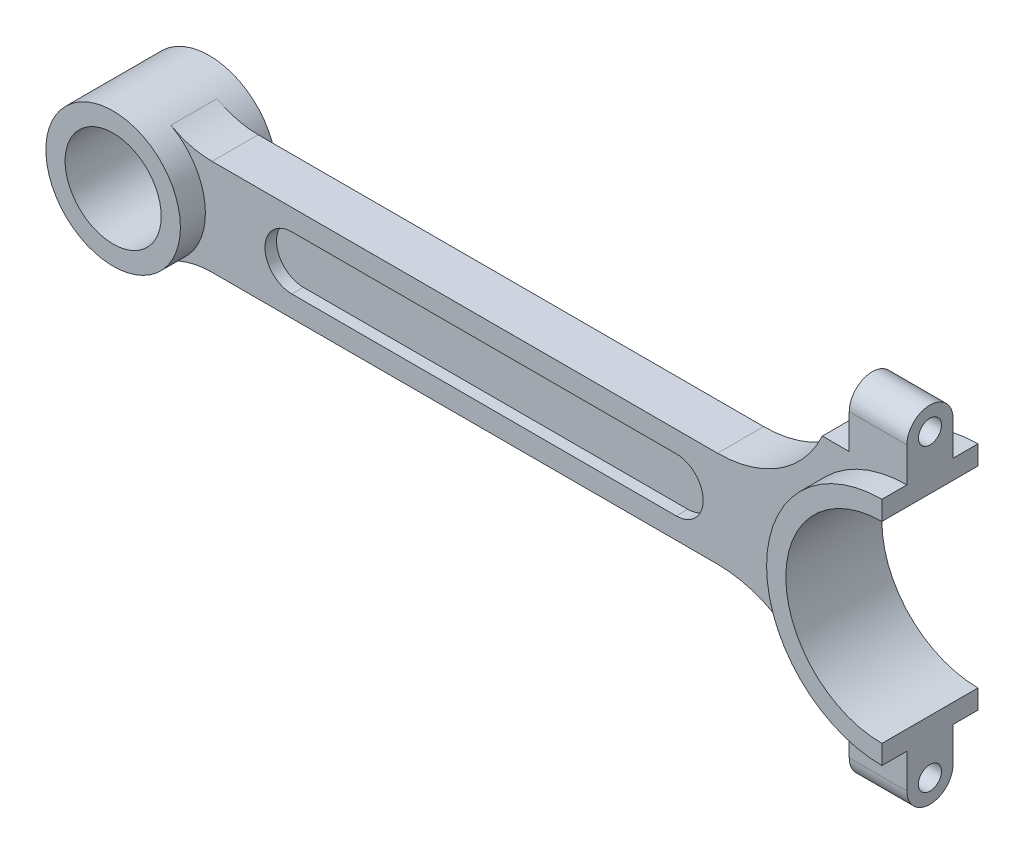
ISO-10303-21;
HEADER;
FILE_DESCRIPTION(('STEP AP214'),'2;1');
FILE_NAME('part.step','',(''),(''),'','','');
FILE_SCHEMA(('AUTOMOTIVE_DESIGN { 1 0 10303 214 1 1 1 1 }'));
ENDSEC;
DATA;
#1=APPLICATION_CONTEXT('core data for automotive mechanical design processes');
#2=APPLICATION_PROTOCOL_DEFINITION('international standard','automotive_design',2000,#1);
#3=PRODUCT_CONTEXT('',#1,'mechanical');
#4=PRODUCT('Part','Part','',(#3));
#5=PRODUCT_RELATED_PRODUCT_CATEGORY('part','',(#4));
#6=PRODUCT_DEFINITION_FORMATION('','',#4);
#7=PRODUCT_DEFINITION_CONTEXT('part definition',#1,'design');
#8=PRODUCT_DEFINITION('design','',#6,#7);
#9=PRODUCT_DEFINITION_SHAPE('','',#8);
#10=(LENGTH_UNIT() NAMED_UNIT(*) SI_UNIT(.MILLI.,.METRE.));
#11=(NAMED_UNIT(*) PLANE_ANGLE_UNIT() SI_UNIT($,.RADIAN.));
#12=(NAMED_UNIT(*) SI_UNIT($,.STERADIAN.) SOLID_ANGLE_UNIT());
#13=UNCERTAINTY_MEASURE_WITH_UNIT(LENGTH_MEASURE(1.E-05),#10,'distance_accuracy_value','');
#14=(GEOMETRIC_REPRESENTATION_CONTEXT(3) GLOBAL_UNCERTAINTY_ASSIGNED_CONTEXT((#13)) GLOBAL_UNIT_ASSIGNED_CONTEXT((#10,
#11,#12)) REPRESENTATION_CONTEXT('',''));
#15=CARTESIAN_POINT('',(0.,0.,0.));
#16=DIRECTION('',(0.,0.,1.));
#17=DIRECTION('',(1.,0.,0.));
#18=AXIS2_PLACEMENT_3D('',#15,#16,#17);
#19=CARTESIAN_POINT('',(400.,0.,-12.));
#20=DIRECTION('',(0.,0.,1.));
#21=DIRECTION('',(1.,0.,0.));
#22=AXIS2_PLACEMENT_3D('',#19,#20,#21);
#23=PLANE('',#22);
#24=CARTESIAN_POINT('',(400.,0.,-12.));
#25=DIRECTION('',(0.,0.,-1.));
#26=DIRECTION('',(1.,0.,0.));
#27=AXIS2_PLACEMENT_3D('',#24,#25,#26);
#28=CIRCLE('',#27,60.);
#29=CARTESIAN_POINT('',(400.,-60.,-12.));
#30=VERTEX_POINT('',#29);
#31=CARTESIAN_POINT('',(400.,60.,-12.));
#32=VERTEX_POINT('',#31);
#33=EDGE_CURVE('E435',#30,#32,#28,.T.);
#34=ORIENTED_EDGE('',*,*,#33,.F.);
#35=DIRECTION('',(0.,-1.,0.));
#36=VECTOR('',#35,1.);
#37=CARTESIAN_POINT('',(400.,-60.,-12.));
#38=LINE('',#37,#36);
#39=CARTESIAN_POINT('',(400.,-78.,-12.));
#40=VERTEX_POINT('',#39);
#41=EDGE_CURVE('E347',#30,#40,#38,.T.);
#42=ORIENTED_EDGE('',*,*,#41,.T.);
#43=DIRECTION('',(1.,0.,0.));
#44=VECTOR('',#43,1.);
#45=CARTESIAN_POINT('',(370.,-78.,-12.));
#46=LINE('',#45,#44);
#47=CARTESIAN_POINT('',(370.,-78.,-12.));
#48=VERTEX_POINT('',#47);
#49=EDGE_CURVE('E343',#48,#40,#46,.T.);
#50=ORIENTED_EDGE('',*,*,#49,.F.);
#51=DIRECTION('',(0.,-1.,0.));
#52=VECTOR('',#51,1.);
#53=CARTESIAN_POINT('',(370.,-60.,-12.));
#54=LINE('',#53,#52);
#55=CARTESIAN_POINT('',(370.,-60.,-12.));
#56=VERTEX_POINT('',#55);
#57=EDGE_CURVE('E333',#56,#48,#54,.T.);
#58=ORIENTED_EDGE('',*,*,#57,.F.);
#59=DIRECTION('',(1.,0.,0.));
#60=VECTOR('',#59,1.);
#61=CARTESIAN_POINT('',(400.,-60.,-12.));
#62=LINE('',#61,#60);
#63=CARTESIAN_POINT('',(356.,-60.,-12.));
#64=VERTEX_POINT('',#63);
#65=EDGE_CURVE('E451',#64,#56,#62,.T.);
#66=ORIENTED_EDGE('',*,*,#65,.F.);
#67=CARTESIAN_POINT('',(301.456439426821,-85.,-12.));
#68=DIRECTION('',(0.,0.,1.));
#69=DIRECTION('',(1.,0.,0.));
#70=AXIS2_PLACEMENT_3D('',#67,#68,#69);
#71=CIRCLE('',#70,60.);
#72=CARTESIAN_POINT('',(301.456439426821,-25.,-12.));
#73=VERTEX_POINT('',#72);
#74=EDGE_CURVE('E549',#64,#73,#71,.T.);
#75=ORIENTED_EDGE('',*,*,#74,.T.);
#76=DIRECTION('',(1.,0.,0.));
#77=VECTOR('',#76,1.);
#78=CARTESIAN_POINT('',(35.,-25.,-12.));
#79=LINE('',#78,#77);
#80=CARTESIAN_POINT('',(38.4707681233427,-25.,-12.));
#81=VERTEX_POINT('',#80);
#82=EDGE_CURVE('E481',#81,#73,#79,.T.);
#83=ORIENTED_EDGE('',*,*,#82,.F.);
#84=CARTESIAN_POINT('',(38.4707681233427,-69.,-12.));
#85=DIRECTION('',(0.,0.,1.));
#86=DIRECTION('',(1.,0.,0.));
#87=AXIS2_PLACEMENT_3D('',#84,#85,#86);
#88=CIRCLE('',#87,44.);
#89=CARTESIAN_POINT('',(17.044011193886,-30.5696202531646,-12.));
#90=VERTEX_POINT('',#89);
#91=EDGE_CURVE('E527',#81,#90,#88,.T.);
#92=ORIENTED_EDGE('',*,*,#91,.T.);
#93=CARTESIAN_POINT('',(0.,0.,-12.));
#94=DIRECTION('',(0.,0.,-1.));
#95=DIRECTION('',(1.,0.,0.));
#96=AXIS2_PLACEMENT_3D('',#93,#94,#95);
#97=CIRCLE('',#96,35.);
#98=CARTESIAN_POINT('',(17.044011193886,30.5696202531646,-12.));
#99=VERTEX_POINT('',#98);
#100=EDGE_CURVE('E478',#99,#90,#97,.T.);
#101=ORIENTED_EDGE('',*,*,#100,.F.);
#102=CARTESIAN_POINT('',(38.4707681233427,69.,-12.));
#103=DIRECTION('',(0.,0.,1.));
#104=DIRECTION('',(1.,0.,0.));
#105=AXIS2_PLACEMENT_3D('',#102,#103,#104);
#106=CIRCLE('',#105,44.);
#107=CARTESIAN_POINT('',(38.4707681233427,25.,-12.));
#108=VERTEX_POINT('',#107);
#109=EDGE_CURVE('E534',#99,#108,#106,.T.);
#110=ORIENTED_EDGE('',*,*,#109,.T.);
#111=DIRECTION('',(-1.,0.,0.));
#112=VECTOR('',#111,1.);
#113=CARTESIAN_POINT('',(35.,25.,-12.));
#114=LINE('',#113,#112);
#115=CARTESIAN_POINT('',(301.456439426821,25.,-12.));
#116=VERTEX_POINT('',#115);
#117=EDGE_CURVE('E475',#116,#108,#114,.T.);
#118=ORIENTED_EDGE('',*,*,#117,.F.);
#119=CARTESIAN_POINT('',(301.456439426821,85.,-12.));
#120=DIRECTION('',(0.,0.,1.));
#121=DIRECTION('',(1.,0.,0.));
#122=AXIS2_PLACEMENT_3D('',#119,#120,#121);
#123=CIRCLE('',#122,60.);
#124=CARTESIAN_POINT('',(356.,60.,-12.));
#125=VERTEX_POINT('',#124);
#126=EDGE_CURVE('E52',#116,#125,#123,.T.);
#127=ORIENTED_EDGE('',*,*,#126,.T.);
#128=DIRECTION('',(-1.,0.,0.));
#129=VECTOR('',#128,1.);
#130=CARTESIAN_POINT('',(400.,60.,-12.));
#131=LINE('',#130,#129);
#132=CARTESIAN_POINT('',(370.,60.,-12.));
#133=VERTEX_POINT('',#132);
#134=EDGE_CURVE('E472',#133,#125,#131,.T.);
#135=ORIENTED_EDGE('',*,*,#134,.F.);
#136=DIRECTION('',(0.,1.,0.));
#137=VECTOR('',#136,1.);
#138=CARTESIAN_POINT('',(370.,60.,-12.));
#139=LINE('',#138,#137);
#140=CARTESIAN_POINT('',(370.,78.,-12.));
#141=VERTEX_POINT('',#140);
#142=EDGE_CURVE('E380',#133,#141,#139,.T.);
#143=ORIENTED_EDGE('',*,*,#142,.T.);
#144=DIRECTION('',(1.,0.,0.));
#145=VECTOR('',#144,1.);
#146=CARTESIAN_POINT('',(370.,78.,-12.));
#147=LINE('',#146,#145);
#148=CARTESIAN_POINT('',(400.,78.,-12.));
#149=VERTEX_POINT('',#148);
#150=EDGE_CURVE('E395',#141,#149,#147,.T.);
#151=ORIENTED_EDGE('',*,*,#150,.T.);
#152=DIRECTION('',(0.,1.,0.));
#153=VECTOR('',#152,1.);
#154=CARTESIAN_POINT('',(400.,60.,-12.));
#155=LINE('',#154,#153);
#156=EDGE_CURVE('E373',#32,#149,#155,.T.);
#157=ORIENTED_EDGE('',*,*,#156,.F.);
#158=EDGE_LOOP('',(#34,#42,#50,#58,#66,#75,#83,#92,#101,#110,#118,#127,#135,#143,#151,#157));
#159=FACE_BOUND('',#158,.T.);
#160=CARTESIAN_POINT('',(280.,0.,-12.));
#161=DIRECTION('',(0.,0.,1.));
#162=DIRECTION('',(1.,0.,0.));
#163=AXIS2_PLACEMENT_3D('',#160,#161,#162);
#164=CIRCLE('',#163,14.);
#165=CARTESIAN_POINT('',(280.,-14.,-12.));
#166=VERTEX_POINT('',#165);
#167=CARTESIAN_POINT('',(280.,14.,-12.));
#168=VERTEX_POINT('',#167);
#169=EDGE_CURVE('E59',#166,#168,#164,.T.);
#170=ORIENTED_EDGE('',*,*,#169,.T.);
#171=DIRECTION('',(-1.,0.,0.));
#172=VECTOR('',#171,1.);
#173=CARTESIAN_POINT('',(280.,14.,-12.));
#174=LINE('',#173,#172);
#175=CARTESIAN_POINT('',(80.,14.,-12.));
#176=VERTEX_POINT('',#175);
#177=EDGE_CURVE('E251',#168,#176,#174,.T.);
#178=ORIENTED_EDGE('',*,*,#177,.T.);
#179=CARTESIAN_POINT('',(80.,0.,-12.));
#180=DIRECTION('',(0.,0.,1.));
#181=DIRECTION('',(1.,0.,0.));
#182=AXIS2_PLACEMENT_3D('',#179,#180,#181);
#183=CIRCLE('',#182,14.);
#184=CARTESIAN_POINT('',(80.,-14.,-12.));
#185=VERTEX_POINT('',#184);
#186=EDGE_CURVE('E255',#176,#185,#183,.T.);
#187=ORIENTED_EDGE('',*,*,#186,.T.);
#188=DIRECTION('',(1.,0.,0.));
#189=VECTOR('',#188,1.);
#190=CARTESIAN_POINT('',(280.,-14.,-12.));
#191=LINE('',#190,#189);
#192=EDGE_CURVE('E264',#185,#166,#191,.T.);
#193=ORIENTED_EDGE('',*,*,#192,.T.);
#194=EDGE_LOOP('',(#170,#178,#187,#193));
#195=FACE_BOUND('',#194,.T.);
#196=ADVANCED_FACE('F43',(#159,#195),#23,.F.);
#197=CARTESIAN_POINT('',(400.,-60.,12.));
#198=DIRECTION('',(0.,1.,0.));
#199=DIRECTION('',(-1.,0.,0.));
#200=AXIS2_PLACEMENT_3D('',#197,#198,#199);
#201=PLANE('',#200);
#202=DIRECTION('',(0.,0.,-1.));
#203=VECTOR('',#202,1.);
#204=CARTESIAN_POINT('',(370.,-60.,12.));
#205=LINE('',#204,#203);
#206=CARTESIAN_POINT('',(370.,-60.,12.));
#207=VERTEX_POINT('',#206);
#208=EDGE_CURVE('E337',#207,#56,#205,.T.);
#209=ORIENTED_EDGE('',*,*,#208,.F.);
#210=DIRECTION('',(1.,0.,0.));
#211=VECTOR('',#210,1.);
#212=CARTESIAN_POINT('',(400.,-60.,12.));
#213=LINE('',#212,#211);
#214=CARTESIAN_POINT('',(356.,-60.,12.));
#215=VERTEX_POINT('',#214);
#216=EDGE_CURVE('E464',#215,#207,#213,.T.);
#217=ORIENTED_EDGE('',*,*,#216,.F.);
#218=DIRECTION('',(0.,0.,-1.));
#219=VECTOR('',#218,1.);
#220=CARTESIAN_POINT('',(356.,-60.,12.));
#221=LINE('',#220,#219);
#222=EDGE_CURVE('E468',#215,#64,#221,.T.);
#223=ORIENTED_EDGE('',*,*,#222,.T.);
#224=ORIENTED_EDGE('',*,*,#65,.T.);
#225=EDGE_LOOP('',(#209,#217,#223,#224));
#226=FACE_BOUND('',#225,.T.);
#227=ADVANCED_FACE('F607',(#226),#201,.F.);
#228=CARTESIAN_POINT('',(400.,60.,12.));
#229=DIRECTION('',(0.,-1.,0.));
#230=DIRECTION('',(1.,0.,0.));
#231=AXIS2_PLACEMENT_3D('',#228,#229,#230);
#232=PLANE('',#231);
#233=DIRECTION('',(0.,0.,-1.));
#234=VECTOR('',#233,1.);
#235=CARTESIAN_POINT('',(370.,60.,12.));
#236=LINE('',#235,#234);
#237=CARTESIAN_POINT('',(370.,60.,12.));
#238=VERTEX_POINT('',#237);
#239=EDGE_CURVE('E377',#238,#133,#236,.T.);
#240=ORIENTED_EDGE('',*,*,#239,.T.);
#241=ORIENTED_EDGE('',*,*,#134,.T.);
#242=DIRECTION('',(0.,0.,-1.));
#243=VECTOR('',#242,1.);
#244=CARTESIAN_POINT('',(356.,60.,12.));
#245=LINE('',#244,#243);
#246=CARTESIAN_POINT('',(356.,60.,12.));
#247=VERTEX_POINT('',#246);
#248=EDGE_CURVE('E491',#247,#125,#245,.T.);
#249=ORIENTED_EDGE('',*,*,#248,.F.);
#250=DIRECTION('',(-1.,0.,0.));
#251=VECTOR('',#250,1.);
#252=CARTESIAN_POINT('',(400.,60.,12.));
#253=LINE('',#252,#251);
#254=EDGE_CURVE('E450',#238,#247,#253,.T.);
#255=ORIENTED_EDGE('',*,*,#254,.F.);
#256=EDGE_LOOP('',(#240,#241,#249,#255));
#257=FACE_BOUND('',#256,.T.);
#258=ADVANCED_FACE('F567',(#257),#232,.F.);
#259=CARTESIAN_POINT('',(0.,0.,25.));
#260=DIRECTION('',(0.,0.,1.));
#261=DIRECTION('',(1.,0.,0.));
#262=AXIS2_PLACEMENT_3D('',#259,#260,#261);
#263=PLANE('',#262);
#264=CARTESIAN_POINT('',(0.,0.,25.));
#265=DIRECTION('',(0.,0.,1.));
#266=DIRECTION('',(1.,0.,0.));
#267=AXIS2_PLACEMENT_3D('',#264,#265,#266);
#268=CIRCLE('',#267,35.);
#269=CARTESIAN_POINT('',(35.,0.,25.));
#270=VERTEX_POINT('',#269);
#271=EDGE_CURVE('E504',#270,#270,#268,.T.);
#272=ORIENTED_EDGE('',*,*,#271,.T.);
#273=EDGE_LOOP('',(#272));
#274=FACE_BOUND('',#273,.T.);
#275=CARTESIAN_POINT('',(0.,0.,25.));
#276=DIRECTION('',(0.,0.,1.));
#277=DIRECTION('',(1.,0.,0.));
#278=AXIS2_PLACEMENT_3D('',#275,#276,#277);
#279=CIRCLE('',#278,25.);
#280=CARTESIAN_POINT('',(25.,0.,25.));
#281=VERTEX_POINT('',#280);
#282=EDGE_CURVE('E496',#281,#281,#279,.T.);
#283=ORIENTED_EDGE('',*,*,#282,.F.);
#284=EDGE_LOOP('',(#283));
#285=FACE_BOUND('',#284,.T.);
#286=ADVANCED_FACE('F896',(#274,#285),#263,.T.);
#287=CARTESIAN_POINT('',(0.,0.,-25.));
#288=DIRECTION('',(0.,0.,1.));
#289=DIRECTION('',(1.,0.,0.));
#290=AXIS2_PLACEMENT_3D('',#287,#288,#289);
#291=PLANE('',#290);
#292=CARTESIAN_POINT('',(0.,0.,-25.));
#293=DIRECTION('',(0.,0.,1.));
#294=DIRECTION('',(1.,0.,0.));
#295=AXIS2_PLACEMENT_3D('',#292,#293,#294);
#296=CIRCLE('',#295,35.);
#297=CARTESIAN_POINT('',(35.,0.,-25.));
#298=VERTEX_POINT('',#297);
#299=EDGE_CURVE('E500',#298,#298,#296,.T.);
#300=ORIENTED_EDGE('',*,*,#299,.F.);
#301=EDGE_LOOP('',(#300));
#302=FACE_BOUND('',#301,.T.);
#303=CARTESIAN_POINT('',(0.,0.,-25.));
#304=DIRECTION('',(0.,0.,1.));
#305=DIRECTION('',(1.,0.,0.));
#306=AXIS2_PLACEMENT_3D('',#303,#304,#305);
#307=CIRCLE('',#306,25.);
#308=CARTESIAN_POINT('',(25.,0.,-25.));
#309=VERTEX_POINT('',#308);
#310=EDGE_CURVE('E495',#309,#309,#307,.T.);
#311=ORIENTED_EDGE('',*,*,#310,.T.);
#312=EDGE_LOOP('',(#311));
#313=FACE_BOUND('',#312,.T.);
#314=ADVANCED_FACE('F1028',(#302,#313),#291,.F.);
#315=CARTESIAN_POINT('',(0.,0.,25.));
#316=DIRECTION('',(0.,0.,-1.));
#317=DIRECTION('',(-1.,0.,0.));
#318=AXIS2_PLACEMENT_3D('',#315,#316,#317);
#319=CYLINDRICAL_SURFACE('',#318,35.);
#320=ORIENTED_EDGE('',*,*,#100,.T.);
#321=DIRECTION('',(0.,0.,-1.));
#322=VECTOR('',#321,1.);
#323=CARTESIAN_POINT('',(17.044011193886,-30.5696202531646,25.));
#324=LINE('',#323,#322);
#325=CARTESIAN_POINT('',(17.044011193886,-30.5696202531646,12.));
#326=VERTEX_POINT('',#325);
#327=EDGE_CURVE('E519',#90,#326,#324,.F.);
#328=ORIENTED_EDGE('',*,*,#327,.T.);
#329=CARTESIAN_POINT('',(0.,0.,12.));
#330=DIRECTION('',(0.,0.,-1.));
#331=DIRECTION('',(1.,0.,0.));
#332=AXIS2_PLACEMENT_3D('',#329,#330,#331);
#333=CIRCLE('',#332,35.);
#334=CARTESIAN_POINT('',(17.044011193886,30.5696202531646,12.));
#335=VERTEX_POINT('',#334);
#336=EDGE_CURVE('E457',#335,#326,#333,.T.);
#337=ORIENTED_EDGE('',*,*,#336,.F.);
#338=DIRECTION('',(0.,0.,-1.));
#339=VECTOR('',#338,1.);
#340=CARTESIAN_POINT('',(17.044011193886,30.5696202531646,25.));
#341=LINE('',#340,#339);
#342=EDGE_CURVE('E515',#335,#99,#341,.T.);
#343=ORIENTED_EDGE('',*,*,#342,.T.);
#344=EDGE_LOOP('',(#320,#328,#337,#343));
#345=FACE_BOUND('',#344,.T.);
#346=ORIENTED_EDGE('',*,*,#271,.F.);
#347=EDGE_LOOP('',(#346));
#348=FACE_BOUND('',#347,.T.);
#349=ORIENTED_EDGE('',*,*,#299,.T.);
#350=EDGE_LOOP('',(#349));
#351=FACE_BOUND('',#350,.T.);
#352=ADVANCED_FACE('F630',(#345,#348,#351),#319,.T.);
#353=CARTESIAN_POINT('',(0.,0.,25.));
#354=DIRECTION('',(0.,0.,-1.));
#355=DIRECTION('',(-1.,0.,0.));
#356=AXIS2_PLACEMENT_3D('',#353,#354,#355);
#357=CYLINDRICAL_SURFACE('',#356,25.);
#358=ORIENTED_EDGE('',*,*,#282,.T.);
#359=EDGE_LOOP('',(#358));
#360=FACE_BOUND('',#359,.T.);
#361=ORIENTED_EDGE('',*,*,#310,.F.);
#362=EDGE_LOOP('',(#361));
#363=FACE_BOUND('',#362,.T.);
#364=ADVANCED_FACE('F636',(#360,#363),#357,.F.);
#365=CARTESIAN_POINT('',(35.,25.,12.));
#366=DIRECTION('',(0.,-1.,0.));
#367=DIRECTION('',(0.,0.,-1.));
#368=AXIS2_PLACEMENT_3D('',#365,#366,#367);
#369=PLANE('',#368);
#370=DIRECTION('',(-1.,0.,0.));
#371=VECTOR('',#370,1.);
#372=CARTESIAN_POINT('',(35.,25.,12.));
#373=LINE('',#372,#371);
#374=CARTESIAN_POINT('',(301.456439426821,25.,12.));
#375=VERTEX_POINT('',#374);
#376=CARTESIAN_POINT('',(38.4707681233427,25.,12.));
#377=VERTEX_POINT('',#376);
#378=EDGE_CURVE('E454',#375,#377,#373,.T.);
#379=ORIENTED_EDGE('',*,*,#378,.F.);
#380=DIRECTION('',(0.,0.,-1.));
#381=VECTOR('',#380,1.);
#382=CARTESIAN_POINT('',(301.456439426821,25.,12.));
#383=LINE('',#382,#381);
#384=EDGE_CURVE('E545',#375,#116,#383,.T.);
#385=ORIENTED_EDGE('',*,*,#384,.T.);
#386=ORIENTED_EDGE('',*,*,#117,.T.);
#387=DIRECTION('',(0.,0.,1.));
#388=VECTOR('',#387,1.);
#389=CARTESIAN_POINT('',(38.4707681233427,25.,12.));
#390=LINE('',#389,#388);
#391=EDGE_CURVE('E523',#108,#377,#390,.T.);
#392=ORIENTED_EDGE('',*,*,#391,.T.);
#393=EDGE_LOOP('',(#379,#385,#386,#392));
#394=FACE_BOUND('',#393,.T.);
#395=ADVANCED_FACE('F634',(#394),#369,.F.);
#396=CARTESIAN_POINT('',(35.,-25.,12.));
#397=DIRECTION('',(0.,1.,0.));
#398=DIRECTION('',(-1.,0.,0.));
#399=AXIS2_PLACEMENT_3D('',#396,#397,#398);
#400=PLANE('',#399);
#401=ORIENTED_EDGE('',*,*,#82,.T.);
#402=DIRECTION('',(0.,0.,1.));
#403=VECTOR('',#402,1.);
#404=CARTESIAN_POINT('',(301.456439426821,-25.,12.));
#405=LINE('',#404,#403);
#406=CARTESIAN_POINT('',(301.456439426821,-25.,12.));
#407=VERTEX_POINT('',#406);
#408=EDGE_CURVE('E542',#73,#407,#405,.T.);
#409=ORIENTED_EDGE('',*,*,#408,.T.);
#410=DIRECTION('',(1.,0.,0.));
#411=VECTOR('',#410,1.);
#412=CARTESIAN_POINT('',(35.,-25.,12.));
#413=LINE('',#412,#411);
#414=CARTESIAN_POINT('',(38.4707681233427,-25.,12.));
#415=VERTEX_POINT('',#414);
#416=EDGE_CURVE('E460',#415,#407,#413,.T.);
#417=ORIENTED_EDGE('',*,*,#416,.F.);
#418=DIRECTION('',(0.,0.,1.));
#419=VECTOR('',#418,1.);
#420=CARTESIAN_POINT('',(38.4707681233427,-25.,-12.));
#421=LINE('',#420,#419);
#422=EDGE_CURVE('E508',#415,#81,#421,.F.);
#423=ORIENTED_EDGE('',*,*,#422,.T.);
#424=EDGE_LOOP('',(#401,#409,#417,#423));
#425=FACE_BOUND('',#424,.T.);
#426=ADVANCED_FACE('F616',(#425),#400,.F.);
#427=CARTESIAN_POINT('',(400.,0.,12.));
#428=DIRECTION('',(0.,0.,1.));
#429=DIRECTION('',(1.,0.,0.));
#430=AXIS2_PLACEMENT_3D('',#427,#428,#429);
#431=PLANE('',#430);
#432=CARTESIAN_POINT('',(280.,0.,12.));
#433=DIRECTION('',(0.,0.,1.));
#434=DIRECTION('',(1.,0.,0.));
#435=AXIS2_PLACEMENT_3D('',#432,#433,#434);
#436=CIRCLE('',#435,14.);
#437=CARTESIAN_POINT('',(280.,-14.,12.));
#438=VERTEX_POINT('',#437);
#439=CARTESIAN_POINT('',(280.,14.,12.));
#440=VERTEX_POINT('',#439);
#441=EDGE_CURVE('E67',#438,#440,#436,.T.);
#442=ORIENTED_EDGE('',*,*,#441,.F.);
#443=DIRECTION('',(1.,0.,0.));
#444=VECTOR('',#443,1.);
#445=CARTESIAN_POINT('',(280.,-14.,12.));
#446=LINE('',#445,#444);
#447=CARTESIAN_POINT('',(80.,-14.,12.));
#448=VERTEX_POINT('',#447);
#449=EDGE_CURVE('E283',#448,#438,#446,.T.);
#450=ORIENTED_EDGE('',*,*,#449,.F.);
#451=CARTESIAN_POINT('',(80.,0.,12.));
#452=DIRECTION('',(0.,0.,1.));
#453=DIRECTION('',(1.,0.,0.));
#454=AXIS2_PLACEMENT_3D('',#451,#452,#453);
#455=CIRCLE('',#454,14.);
#456=CARTESIAN_POINT('',(80.,14.,12.));
#457=VERTEX_POINT('',#456);
#458=EDGE_CURVE('E302',#457,#448,#455,.T.);
#459=ORIENTED_EDGE('',*,*,#458,.F.);
#460=DIRECTION('',(-1.,0.,0.));
#461=VECTOR('',#460,1.);
#462=CARTESIAN_POINT('',(280.,14.,12.));
#463=LINE('',#462,#461);
#464=EDGE_CURVE('E298',#440,#457,#463,.T.);
#465=ORIENTED_EDGE('',*,*,#464,.F.);
#466=EDGE_LOOP('',(#442,#450,#459,#465));
#467=FACE_BOUND('',#466,.T.);
#468=CARTESIAN_POINT('',(400.,0.,12.));
#469=DIRECTION('',(0.,0.,-1.));
#470=DIRECTION('',(1.,0.,0.));
#471=AXIS2_PLACEMENT_3D('',#468,#469,#470);
#472=CIRCLE('',#471,60.);
#473=CARTESIAN_POINT('',(400.,-60.,12.));
#474=VERTEX_POINT('',#473);
#475=CARTESIAN_POINT('',(400.,60.,12.));
#476=VERTEX_POINT('',#475);
#477=EDGE_CURVE('E447',#474,#476,#472,.T.);
#478=ORIENTED_EDGE('',*,*,#477,.T.);
#479=DIRECTION('',(0.,-1.,0.));
#480=VECTOR('',#479,1.);
#481=CARTESIAN_POINT('',(400.,78.,12.));
#482=LINE('',#481,#480);
#483=CARTESIAN_POINT('',(400.,78.,12.));
#484=VERTEX_POINT('',#483);
#485=EDGE_CURVE('E388',#484,#476,#482,.T.);
#486=ORIENTED_EDGE('',*,*,#485,.F.);
#487=DIRECTION('',(1.,0.,0.));
#488=VECTOR('',#487,1.);
#489=CARTESIAN_POINT('',(370.,78.,12.));
#490=LINE('',#489,#488);
#491=CARTESIAN_POINT('',(370.,78.,12.));
#492=VERTEX_POINT('',#491);
#493=EDGE_CURVE('E384',#492,#484,#490,.T.);
#494=ORIENTED_EDGE('',*,*,#493,.F.);
#495=DIRECTION('',(0.,-1.,0.));
#496=VECTOR('',#495,1.);
#497=CARTESIAN_POINT('',(370.,78.,12.));
#498=LINE('',#497,#496);
#499=EDGE_CURVE('E372',#492,#238,#498,.T.);
#500=ORIENTED_EDGE('',*,*,#499,.T.);
#501=ORIENTED_EDGE('',*,*,#254,.T.);
#502=CARTESIAN_POINT('',(301.456439426821,85.,12.));
#503=DIRECTION('',(0.,0.,1.));
#504=DIRECTION('',(1.,0.,0.));
#505=AXIS2_PLACEMENT_3D('',#502,#503,#504);
#506=CIRCLE('',#505,60.);
#507=EDGE_CURVE('E11',#247,#375,#506,.F.);
#508=ORIENTED_EDGE('',*,*,#507,.T.);
#509=ORIENTED_EDGE('',*,*,#378,.T.);
#510=CARTESIAN_POINT('',(38.4707681233427,69.,12.));
#511=DIRECTION('',(0.,0.,1.));
#512=DIRECTION('',(1.,0.,0.));
#513=AXIS2_PLACEMENT_3D('',#510,#511,#512);
#514=CIRCLE('',#513,44.);
#515=EDGE_CURVE('E538',#377,#335,#514,.F.);
#516=ORIENTED_EDGE('',*,*,#515,.T.);
#517=ORIENTED_EDGE('',*,*,#336,.T.);
#518=CARTESIAN_POINT('',(38.4707681233427,-69.,12.));
#519=DIRECTION('',(0.,0.,1.));
#520=DIRECTION('',(1.,0.,0.));
#521=AXIS2_PLACEMENT_3D('',#518,#519,#520);
#522=CIRCLE('',#521,44.);
#523=EDGE_CURVE('E531',#326,#415,#522,.F.);
#524=ORIENTED_EDGE('',*,*,#523,.T.);
#525=ORIENTED_EDGE('',*,*,#416,.T.);
#526=CARTESIAN_POINT('',(301.456439426821,-85.,12.));
#527=DIRECTION('',(0.,0.,1.));
#528=DIRECTION('',(1.,0.,0.));
#529=AXIS2_PLACEMENT_3D('',#526,#527,#528);
#530=CIRCLE('',#529,60.);
#531=EDGE_CURVE('E552',#407,#215,#530,.F.);
#532=ORIENTED_EDGE('',*,*,#531,.T.);
#533=ORIENTED_EDGE('',*,*,#216,.T.);
#534=DIRECTION('',(0.,1.,0.));
#535=VECTOR('',#534,1.);
#536=CARTESIAN_POINT('',(370.,-78.,12.));
#537=LINE('',#536,#535);
#538=CARTESIAN_POINT('',(370.,-78.,12.));
#539=VERTEX_POINT('',#538);
#540=EDGE_CURVE('E340',#539,#207,#537,.T.);
#541=ORIENTED_EDGE('',*,*,#540,.F.);
#542=DIRECTION('',(1.,0.,0.));
#543=VECTOR('',#542,1.);
#544=CARTESIAN_POINT('',(370.,-78.,12.));
#545=LINE('',#544,#543);
#546=CARTESIAN_POINT('',(400.,-78.,12.));
#547=VERTEX_POINT('',#546);
#548=EDGE_CURVE('E352',#539,#547,#545,.T.);
#549=ORIENTED_EDGE('',*,*,#548,.T.);
#550=DIRECTION('',(0.,1.,0.));
#551=VECTOR('',#550,1.);
#552=CARTESIAN_POINT('',(400.,-78.,12.));
#553=LINE('',#552,#551);
#554=EDGE_CURVE('E334',#547,#474,#553,.T.);
#555=ORIENTED_EDGE('',*,*,#554,.T.);
#556=EDGE_LOOP('',(#478,#486,#494,#500,#501,#508,#509,#516,#517,#524,#525,#532,#533,#541,#549,#555));
#557=FACE_BOUND('',#556,.T.);
#558=ADVANCED_FACE('F574',(#467,#557),#431,.T.);
#559=CARTESIAN_POINT('',(400.,0.,25.));
#560=DIRECTION('',(0.,0.,-1.));
#561=DIRECTION('',(-1.,0.,0.));
#562=AXIS2_PLACEMENT_3D('',#559,#560,#561);
#563=CYLINDRICAL_SURFACE('',#562,60.);
#564=DIRECTION('',(0.,0.,-1.));
#565=VECTOR('',#564,1.);
#566=CARTESIAN_POINT('',(400.,-60.,25.));
#567=LINE('',#566,#565);
#568=CARTESIAN_POINT('',(400.,-60.,-25.));
#569=VERTEX_POINT('',#568);
#570=EDGE_CURVE('E409',#30,#569,#567,.T.);
#571=ORIENTED_EDGE('',*,*,#570,.F.);
#572=ORIENTED_EDGE('',*,*,#33,.T.);
#573=DIRECTION('',(0.,0.,-1.));
#574=VECTOR('',#573,1.);
#575=CARTESIAN_POINT('',(400.,60.,25.));
#576=LINE('',#575,#574);
#577=CARTESIAN_POINT('',(400.,60.,-25.));
#578=VERTEX_POINT('',#577);
#579=EDGE_CURVE('E404',#32,#578,#576,.T.);
#580=ORIENTED_EDGE('',*,*,#579,.T.);
#581=CARTESIAN_POINT('',(400.,0.,-25.));
#582=DIRECTION('',(0.,0.,1.));
#583=DIRECTION('',(1.,0.,0.));
#584=AXIS2_PLACEMENT_3D('',#581,#582,#583);
#585=CIRCLE('',#584,60.);
#586=EDGE_CURVE('E422',#578,#569,#585,.T.);
#587=ORIENTED_EDGE('',*,*,#586,.T.);
#588=EDGE_LOOP('',(#571,#572,#580,#587));
#589=FACE_BOUND('',#588,.T.);
#590=ADVANCED_FACE('F587',(#589),#563,.T.);
#591=CARTESIAN_POINT('',(400.,0.,25.));
#592=DIRECTION('',(0.,0.,-1.));
#593=DIRECTION('',(-1.,0.,0.));
#594=AXIS2_PLACEMENT_3D('',#591,#592,#593);
#595=CYLINDRICAL_SURFACE('',#594,50.);
#596=CARTESIAN_POINT('',(400.,0.,-25.));
#597=DIRECTION('',(0.,0.,-1.));
#598=DIRECTION('',(1.,0.,0.));
#599=AXIS2_PLACEMENT_3D('',#596,#597,#598);
#600=CIRCLE('',#599,50.);
#601=CARTESIAN_POINT('',(400.,-50.,-25.));
#602=VERTEX_POINT('',#601);
#603=CARTESIAN_POINT('',(400.,50.,-25.));
#604=VERTEX_POINT('',#603);
#605=EDGE_CURVE('E431',#602,#604,#600,.T.);
#606=ORIENTED_EDGE('',*,*,#605,.T.);
#607=DIRECTION('',(0.,0.,-1.));
#608=VECTOR('',#607,1.);
#609=CARTESIAN_POINT('',(400.,50.,25.));
#610=LINE('',#609,#608);
#611=CARTESIAN_POINT('',(400.,50.,25.));
#612=VERTEX_POINT('',#611);
#613=EDGE_CURVE('E398',#612,#604,#610,.T.);
#614=ORIENTED_EDGE('',*,*,#613,.F.);
#615=CARTESIAN_POINT('',(400.,0.,25.));
#616=DIRECTION('',(0.,0.,-1.));
#617=DIRECTION('',(1.,0.,0.));
#618=AXIS2_PLACEMENT_3D('',#615,#616,#617);
#619=CIRCLE('',#618,50.);
#620=CARTESIAN_POINT('',(400.,-50.,25.));
#621=VERTEX_POINT('',#620);
#622=EDGE_CURVE('E423',#621,#612,#619,.T.);
#623=ORIENTED_EDGE('',*,*,#622,.F.);
#624=DIRECTION('',(0.,0.,-1.));
#625=VECTOR('',#624,1.);
#626=CARTESIAN_POINT('',(400.,-50.,25.));
#627=LINE('',#626,#625);
#628=EDGE_CURVE('E414',#621,#602,#627,.T.);
#629=ORIENTED_EDGE('',*,*,#628,.T.);
#630=EDGE_LOOP('',(#606,#614,#623,#629));
#631=FACE_BOUND('',#630,.T.);
#632=ADVANCED_FACE('F672',(#631),#595,.F.);
#633=CARTESIAN_POINT('',(400.,50.,25.));
#634=DIRECTION('',(-1.,0.,0.));
#635=DIRECTION('',(0.,0.,1.));
#636=AXIS2_PLACEMENT_3D('',#633,#634,#635);
#637=PLANE('',#636);
#638=DIRECTION('',(0.,1.,0.));
#639=VECTOR('',#638,1.);
#640=CARTESIAN_POINT('',(400.,50.,-25.));
#641=LINE('',#640,#639);
#642=EDGE_CURVE('E427',#604,#578,#641,.T.);
#643=ORIENTED_EDGE('',*,*,#642,.T.);
#644=ORIENTED_EDGE('',*,*,#579,.F.);
#645=ORIENTED_EDGE('',*,*,#156,.T.);
#646=CARTESIAN_POINT('',(400.,78.,0.));
#647=DIRECTION('',(1.,0.,0.));
#648=DIRECTION('',(0.,0.,-1.));
#649=AXIS2_PLACEMENT_3D('',#646,#647,#648);
#650=CIRCLE('',#649,12.);
#651=EDGE_CURVE('E364',#149,#484,#650,.T.);
#652=ORIENTED_EDGE('',*,*,#651,.T.);
#653=ORIENTED_EDGE('',*,*,#485,.T.);
#654=CARTESIAN_POINT('',(400.,60.,25.));
#655=VERTEX_POINT('',#654);
#656=EDGE_CURVE('E405',#655,#476,#576,.T.);
#657=ORIENTED_EDGE('',*,*,#656,.F.);
#658=DIRECTION('',(0.,1.,0.));
#659=VECTOR('',#658,1.);
#660=CARTESIAN_POINT('',(400.,50.,25.));
#661=LINE('',#660,#659);
#662=EDGE_CURVE('E441',#612,#655,#661,.T.);
#663=ORIENTED_EDGE('',*,*,#662,.F.);
#664=ORIENTED_EDGE('',*,*,#613,.T.);
#665=EDGE_LOOP('',(#643,#644,#645,#652,#653,#657,#663,#664));
#666=FACE_BOUND('',#665,.T.);
#667=CARTESIAN_POINT('',(400.,78.,0.));
#668=DIRECTION('',(1.,0.,0.));
#669=DIRECTION('',(0.,0.,-1.));
#670=AXIS2_PLACEMENT_3D('',#667,#668,#669);
#671=CIRCLE('',#670,6.);
#672=CARTESIAN_POINT('',(400.,78.,-6.00000000000001));
#673=VERTEX_POINT('',#672);
#674=EDGE_CURVE('E356',#673,#673,#671,.T.);
#675=ORIENTED_EDGE('',*,*,#674,.F.);
#676=EDGE_LOOP('',(#675));
#677=FACE_BOUND('',#676,.T.);
#678=ADVANCED_FACE('F582',(#666,#677),#637,.F.);
#679=ORIENTED_EDGE('',*,*,#477,.F.);
#680=CARTESIAN_POINT('',(400.,-60.,25.));
#681=VERTEX_POINT('',#680);
#682=EDGE_CURVE('E410',#681,#474,#567,.T.);
#683=ORIENTED_EDGE('',*,*,#682,.F.);
#684=CARTESIAN_POINT('',(400.,0.,25.));
#685=DIRECTION('',(0.,0.,1.));
#686=DIRECTION('',(1.,0.,0.));
#687=AXIS2_PLACEMENT_3D('',#684,#685,#686);
#688=CIRCLE('',#687,60.);
#689=EDGE_CURVE('E438',#655,#681,#688,.T.);
#690=ORIENTED_EDGE('',*,*,#689,.F.);
#691=ORIENTED_EDGE('',*,*,#656,.T.);
#692=EDGE_LOOP('',(#679,#683,#690,#691));
#693=FACE_BOUND('',#692,.T.);
#694=ADVANCED_FACE('F666',(#693),#563,.T.);
#695=CARTESIAN_POINT('',(400.,-50.,25.));
#696=DIRECTION('',(-1.,0.,0.));
#697=DIRECTION('',(0.,0.,1.));
#698=AXIS2_PLACEMENT_3D('',#695,#696,#697);
#699=PLANE('',#698);
#700=DIRECTION('',(0.,1.,0.));
#701=VECTOR('',#700,1.);
#702=CARTESIAN_POINT('',(400.,-50.,-25.));
#703=LINE('',#702,#701);
#704=EDGE_CURVE('E419',#569,#602,#703,.T.);
#705=ORIENTED_EDGE('',*,*,#704,.T.);
#706=ORIENTED_EDGE('',*,*,#628,.F.);
#707=DIRECTION('',(0.,1.,0.));
#708=VECTOR('',#707,1.);
#709=CARTESIAN_POINT('',(400.,-50.,25.));
#710=LINE('',#709,#708);
#711=EDGE_CURVE('E418',#681,#621,#710,.T.);
#712=ORIENTED_EDGE('',*,*,#711,.F.);
#713=ORIENTED_EDGE('',*,*,#682,.T.);
#714=ORIENTED_EDGE('',*,*,#554,.F.);
#715=CARTESIAN_POINT('',(400.,-78.,0.));
#716=DIRECTION('',(-1.,0.,0.));
#717=DIRECTION('',(0.,0.,-1.));
#718=AXIS2_PLACEMENT_3D('',#715,#716,#717);
#719=CIRCLE('',#718,12.);
#720=EDGE_CURVE('E325',#40,#547,#719,.T.);
#721=ORIENTED_EDGE('',*,*,#720,.F.);
#722=ORIENTED_EDGE('',*,*,#41,.F.);
#723=ORIENTED_EDGE('',*,*,#570,.T.);
#724=EDGE_LOOP('',(#705,#706,#712,#713,#714,#721,#722,#723));
#725=FACE_BOUND('',#724,.T.);
#726=CARTESIAN_POINT('',(400.,-78.,0.));
#727=DIRECTION('',(-1.,0.,0.));
#728=DIRECTION('',(0.,0.,-1.));
#729=AXIS2_PLACEMENT_3D('',#726,#727,#728);
#730=CIRCLE('',#729,6.);
#731=CARTESIAN_POINT('',(400.,-78.,-6.00000000000001));
#732=VERTEX_POINT('',#731);
#733=EDGE_CURVE('E312',#732,#732,#730,.T.);
#734=ORIENTED_EDGE('',*,*,#733,.T.);
#735=EDGE_LOOP('',(#734));
#736=FACE_BOUND('',#735,.T.);
#737=ADVANCED_FACE('F591',(#725,#736),#699,.F.);
#738=CARTESIAN_POINT('',(400.,0.,25.));
#739=DIRECTION('',(0.,0.,1.));
#740=DIRECTION('',(1.,0.,0.));
#741=AXIS2_PLACEMENT_3D('',#738,#739,#740);
#742=PLANE('',#741);
#743=ORIENTED_EDGE('',*,*,#622,.T.);
#744=ORIENTED_EDGE('',*,*,#662,.T.);
#745=ORIENTED_EDGE('',*,*,#689,.T.);
#746=ORIENTED_EDGE('',*,*,#711,.T.);
#747=EDGE_LOOP('',(#743,#744,#745,#746));
#748=FACE_BOUND('',#747,.T.);
#749=ADVANCED_FACE('F656',(#748),#742,.T.);
#750=CARTESIAN_POINT('',(400.,0.,-25.));
#751=DIRECTION('',(0.,0.,1.));
#752=DIRECTION('',(1.,0.,0.));
#753=AXIS2_PLACEMENT_3D('',#750,#751,#752);
#754=PLANE('',#753);
#755=ORIENTED_EDGE('',*,*,#605,.F.);
#756=ORIENTED_EDGE('',*,*,#704,.F.);
#757=ORIENTED_EDGE('',*,*,#586,.F.);
#758=ORIENTED_EDGE('',*,*,#642,.F.);
#759=EDGE_LOOP('',(#755,#756,#757,#758));
#760=FACE_BOUND('',#759,.T.);
#761=ADVANCED_FACE('F659',(#760),#754,.F.);
#762=CARTESIAN_POINT('',(38.4707681233427,-69.,25.));
#763=DIRECTION('',(0.,0.,-1.));
#764=DIRECTION('',(-1.,0.,0.));
#765=AXIS2_PLACEMENT_3D('',#762,#763,#764);
#766=CYLINDRICAL_SURFACE('',#765,44.);
#767=ORIENTED_EDGE('',*,*,#523,.F.);
#768=ORIENTED_EDGE('',*,*,#327,.F.);
#769=ORIENTED_EDGE('',*,*,#91,.F.);
#770=ORIENTED_EDGE('',*,*,#422,.F.);
#771=EDGE_LOOP('',(#767,#768,#769,#770));
#772=FACE_BOUND('',#771,.T.);
#773=ADVANCED_FACE('F621',(#772),#766,.F.);
#774=CARTESIAN_POINT('',(38.4707681233427,69.,25.));
#775=DIRECTION('',(0.,0.,-1.));
#776=DIRECTION('',(-1.,0.,0.));
#777=AXIS2_PLACEMENT_3D('',#774,#775,#776);
#778=CYLINDRICAL_SURFACE('',#777,44.);
#779=ORIENTED_EDGE('',*,*,#515,.F.);
#780=ORIENTED_EDGE('',*,*,#391,.F.);
#781=ORIENTED_EDGE('',*,*,#109,.F.);
#782=ORIENTED_EDGE('',*,*,#342,.F.);
#783=EDGE_LOOP('',(#779,#780,#781,#782));
#784=FACE_BOUND('',#783,.T.);
#785=ADVANCED_FACE('F629',(#784),#778,.F.);
#786=CARTESIAN_POINT('',(301.456439426821,-85.,12.));
#787=DIRECTION('',(0.,0.,1.));
#788=DIRECTION('',(1.,0.,0.));
#789=AXIS2_PLACEMENT_3D('',#786,#787,#788);
#790=CYLINDRICAL_SURFACE('',#789,60.);
#791=ORIENTED_EDGE('',*,*,#531,.F.);
#792=ORIENTED_EDGE('',*,*,#408,.F.);
#793=ORIENTED_EDGE('',*,*,#74,.F.);
#794=ORIENTED_EDGE('',*,*,#222,.F.);
#795=EDGE_LOOP('',(#791,#792,#793,#794));
#796=FACE_BOUND('',#795,.T.);
#797=ADVANCED_FACE('F612',(#796),#790,.F.);
#798=CARTESIAN_POINT('',(301.456439426821,85.,12.));
#799=DIRECTION('',(0.,0.,-1.));
#800=DIRECTION('',(-1.,0.,0.));
#801=AXIS2_PLACEMENT_3D('',#798,#799,#800);
#802=CYLINDRICAL_SURFACE('',#801,60.);
#803=ORIENTED_EDGE('',*,*,#507,.F.);
#804=ORIENTED_EDGE('',*,*,#248,.T.);
#805=ORIENTED_EDGE('',*,*,#126,.F.);
#806=ORIENTED_EDGE('',*,*,#384,.F.);
#807=EDGE_LOOP('',(#803,#804,#805,#806));
#808=FACE_BOUND('',#807,.T.);
#809=ADVANCED_FACE('F45',(#808),#802,.F.);
#810=CARTESIAN_POINT('',(370.,78.,0.));
#811=DIRECTION('',(1.,0.,0.));
#812=DIRECTION('',(0.,0.,-1.));
#813=AXIS2_PLACEMENT_3D('',#810,#811,#812);
#814=CYLINDRICAL_SURFACE('',#813,12.);
#815=ORIENTED_EDGE('',*,*,#651,.F.);
#816=ORIENTED_EDGE('',*,*,#150,.F.);
#817=CARTESIAN_POINT('',(370.,78.,0.));
#818=DIRECTION('',(1.,0.,0.));
#819=DIRECTION('',(0.,0.,-1.));
#820=AXIS2_PLACEMENT_3D('',#817,#818,#819);
#821=CIRCLE('',#820,12.);
#822=EDGE_CURVE('E368',#141,#492,#821,.T.);
#823=ORIENTED_EDGE('',*,*,#822,.T.);
#824=ORIENTED_EDGE('',*,*,#493,.T.);
#825=EDGE_LOOP('',(#815,#816,#823,#824));
#826=FACE_BOUND('',#825,.T.);
#827=ADVANCED_FACE('F578',(#826),#814,.T.);
#828=CARTESIAN_POINT('',(370.,78.,0.));
#829=DIRECTION('',(1.,0.,0.));
#830=DIRECTION('',(0.,0.,-1.));
#831=AXIS2_PLACEMENT_3D('',#828,#829,#830);
#832=PLANE('',#831);
#833=CARTESIAN_POINT('',(370.,78.,0.));
#834=DIRECTION('',(1.,0.,0.));
#835=DIRECTION('',(0.,0.,-1.));
#836=AXIS2_PLACEMENT_3D('',#833,#834,#835);
#837=CIRCLE('',#836,6.);
#838=CARTESIAN_POINT('',(370.,78.,-6.00000000000001));
#839=VERTEX_POINT('',#838);
#840=EDGE_CURVE('E360',#839,#839,#837,.T.);
#841=ORIENTED_EDGE('',*,*,#840,.T.);
#842=EDGE_LOOP('',(#841));
#843=FACE_BOUND('',#842,.T.);
#844=ORIENTED_EDGE('',*,*,#822,.F.);
#845=ORIENTED_EDGE('',*,*,#142,.F.);
#846=ORIENTED_EDGE('',*,*,#239,.F.);
#847=ORIENTED_EDGE('',*,*,#499,.F.);
#848=EDGE_LOOP('',(#844,#845,#846,#847));
#849=FACE_BOUND('',#848,.T.);
#850=ADVANCED_FACE('F572',(#843,#849),#832,.F.);
#851=CARTESIAN_POINT('',(370.,78.,0.));
#852=DIRECTION('',(1.,0.,0.));
#853=DIRECTION('',(0.,0.,-1.));
#854=AXIS2_PLACEMENT_3D('',#851,#852,#853);
#855=CYLINDRICAL_SURFACE('',#854,6.);
#856=ORIENTED_EDGE('',*,*,#840,.F.);
#857=EDGE_LOOP('',(#856));
#858=FACE_BOUND('',#857,.T.);
#859=ORIENTED_EDGE('',*,*,#674,.T.);
#860=EDGE_LOOP('',(#859));
#861=FACE_BOUND('',#860,.T.);
#862=ADVANCED_FACE('F680',(#858,#861),#855,.F.);
#863=CARTESIAN_POINT('',(370.,-78.,0.));
#864=DIRECTION('',(1.,0.,0.));
#865=DIRECTION('',(0.,0.,-1.));
#866=AXIS2_PLACEMENT_3D('',#863,#864,#865);
#867=PLANE('',#866);
#868=CARTESIAN_POINT('',(370.,-78.,0.));
#869=DIRECTION('',(-1.,0.,0.));
#870=DIRECTION('',(0.,0.,-1.));
#871=AXIS2_PLACEMENT_3D('',#868,#869,#870);
#872=CIRCLE('',#871,12.);
#873=EDGE_CURVE('E329',#48,#539,#872,.T.);
#874=ORIENTED_EDGE('',*,*,#873,.T.);
#875=ORIENTED_EDGE('',*,*,#540,.T.);
#876=ORIENTED_EDGE('',*,*,#208,.T.);
#877=ORIENTED_EDGE('',*,*,#57,.T.);
#878=EDGE_LOOP('',(#874,#875,#876,#877));
#879=FACE_BOUND('',#878,.T.);
#880=CARTESIAN_POINT('',(370.,-78.,0.));
#881=DIRECTION('',(-1.,0.,0.));
#882=DIRECTION('',(0.,0.,-1.));
#883=AXIS2_PLACEMENT_3D('',#880,#881,#882);
#884=CIRCLE('',#883,6.);
#885=CARTESIAN_POINT('',(370.,-78.,-6.00000000000001));
#886=VERTEX_POINT('',#885);
#887=EDGE_CURVE('E321',#886,#886,#884,.T.);
#888=ORIENTED_EDGE('',*,*,#887,.F.);
#889=EDGE_LOOP('',(#888));
#890=FACE_BOUND('',#889,.T.);
#891=ADVANCED_FACE('F602',(#879,#890),#867,.F.);
#892=CARTESIAN_POINT('',(370.,-78.,0.));
#893=DIRECTION('',(1.,0.,0.));
#894=DIRECTION('',(0.,0.,-1.));
#895=AXIS2_PLACEMENT_3D('',#892,#893,#894);
#896=CYLINDRICAL_SURFACE('',#895,12.);
#897=ORIENTED_EDGE('',*,*,#720,.T.);
#898=ORIENTED_EDGE('',*,*,#548,.F.);
#899=ORIENTED_EDGE('',*,*,#873,.F.);
#900=ORIENTED_EDGE('',*,*,#49,.T.);
#901=EDGE_LOOP('',(#897,#898,#899,#900));
#902=FACE_BOUND('',#901,.T.);
#903=ADVANCED_FACE('F599',(#902),#896,.T.);
#904=CARTESIAN_POINT('',(370.,-78.,0.));
#905=DIRECTION('',(1.,0.,0.));
#906=DIRECTION('',(0.,0.,-1.));
#907=AXIS2_PLACEMENT_3D('',#904,#905,#906);
#908=CYLINDRICAL_SURFACE('',#907,6.);
#909=ORIENTED_EDGE('',*,*,#887,.T.);
#910=EDGE_LOOP('',(#909));
#911=FACE_BOUND('',#910,.T.);
#912=ORIENTED_EDGE('',*,*,#733,.F.);
#913=EDGE_LOOP('',(#912));
#914=FACE_BOUND('',#913,.T.);
#915=ADVANCED_FACE('F687',(#911,#914),#908,.F.);
#916=CARTESIAN_POINT('',(280.,0.,6.));
#917=DIRECTION('',(0.,0.,1.));
#918=DIRECTION('',(1.,0.,0.));
#919=AXIS2_PLACEMENT_3D('',#916,#917,#918);
#920=CYLINDRICAL_SURFACE('',#919,14.);
#921=ORIENTED_EDGE('',*,*,#441,.T.);
#922=DIRECTION('',(0.,0.,1.));
#923=VECTOR('',#922,1.);
#924=CARTESIAN_POINT('',(280.,14.,6.));
#925=LINE('',#924,#923);
#926=CARTESIAN_POINT('',(280.,14.,6.));
#927=VERTEX_POINT('',#926);
#928=EDGE_CURVE('E295',#927,#440,#925,.T.);
#929=ORIENTED_EDGE('',*,*,#928,.F.);
#930=CARTESIAN_POINT('',(280.,0.,6.));
#931=DIRECTION('',(0.,0.,1.));
#932=DIRECTION('',(1.,0.,0.));
#933=AXIS2_PLACEMENT_3D('',#930,#931,#932);
#934=CIRCLE('',#933,14.);
#935=CARTESIAN_POINT('',(280.,-14.,6.));
#936=VERTEX_POINT('',#935);
#937=EDGE_CURVE('E278',#936,#927,#934,.T.);
#938=ORIENTED_EDGE('',*,*,#937,.F.);
#939=DIRECTION('',(0.,0.,1.));
#940=VECTOR('',#939,1.);
#941=CARTESIAN_POINT('',(280.,-14.,6.));
#942=LINE('',#941,#940);
#943=EDGE_CURVE('E309',#936,#438,#942,.T.);
#944=ORIENTED_EDGE('',*,*,#943,.T.);
#945=EDGE_LOOP('',(#921,#929,#938,#944));
#946=FACE_BOUND('',#945,.T.);
#947=ADVANCED_FACE('F692',(#946),#920,.F.);
#948=CARTESIAN_POINT('',(280.,-14.,6.));
#949=DIRECTION('',(0.,-1.,0.));
#950=DIRECTION('',(1.,0.,0.));
#951=AXIS2_PLACEMENT_3D('',#948,#949,#950);
#952=PLANE('',#951);
#953=ORIENTED_EDGE('',*,*,#449,.T.);
#954=ORIENTED_EDGE('',*,*,#943,.F.);
#955=DIRECTION('',(1.,0.,0.));
#956=VECTOR('',#955,1.);
#957=CARTESIAN_POINT('',(280.,-14.,6.));
#958=LINE('',#957,#956);
#959=CARTESIAN_POINT('',(80.,-14.,6.));
#960=VERTEX_POINT('',#959);
#961=EDGE_CURVE('E291',#960,#936,#958,.T.);
#962=ORIENTED_EDGE('',*,*,#961,.F.);
#963=DIRECTION('',(0.,0.,1.));
#964=VECTOR('',#963,1.);
#965=CARTESIAN_POINT('',(80.,-14.,6.));
#966=LINE('',#965,#964);
#967=EDGE_CURVE('E313',#960,#448,#966,.T.);
#968=ORIENTED_EDGE('',*,*,#967,.T.);
#969=EDGE_LOOP('',(#953,#954,#962,#968));
#970=FACE_BOUND('',#969,.T.);
#971=ADVANCED_FACE('F696',(#970),#952,.F.);
#972=CARTESIAN_POINT('',(80.,0.,6.));
#973=DIRECTION('',(0.,0.,1.));
#974=DIRECTION('',(1.,0.,0.));
#975=AXIS2_PLACEMENT_3D('',#972,#973,#974);
#976=CYLINDRICAL_SURFACE('',#975,14.);
#977=ORIENTED_EDGE('',*,*,#458,.T.);
#978=ORIENTED_EDGE('',*,*,#967,.F.);
#979=CARTESIAN_POINT('',(80.,0.,6.));
#980=DIRECTION('',(0.,0.,1.));
#981=DIRECTION('',(1.,0.,0.));
#982=AXIS2_PLACEMENT_3D('',#979,#980,#981);
#983=CIRCLE('',#982,14.);
#984=CARTESIAN_POINT('',(80.,14.,6.));
#985=VERTEX_POINT('',#984);
#986=EDGE_CURVE('E287',#985,#960,#983,.T.);
#987=ORIENTED_EDGE('',*,*,#986,.F.);
#988=DIRECTION('',(0.,0.,1.));
#989=VECTOR('',#988,1.);
#990=CARTESIAN_POINT('',(80.,14.,6.));
#991=LINE('',#990,#989);
#992=EDGE_CURVE('E316',#985,#457,#991,.T.);
#993=ORIENTED_EDGE('',*,*,#992,.T.);
#994=EDGE_LOOP('',(#977,#978,#987,#993));
#995=FACE_BOUND('',#994,.T.);
#996=ADVANCED_FACE('F701',(#995),#976,.F.);
#997=CARTESIAN_POINT('',(280.,14.,6.));
#998=DIRECTION('',(0.,1.,0.));
#999=DIRECTION('',(-1.,0.,0.));
#1000=AXIS2_PLACEMENT_3D('',#997,#998,#999);
#1001=PLANE('',#1000);
#1002=ORIENTED_EDGE('',*,*,#464,.T.);
#1003=ORIENTED_EDGE('',*,*,#992,.F.);
#1004=DIRECTION('',(-1.,0.,0.));
#1005=VECTOR('',#1004,1.);
#1006=CARTESIAN_POINT('',(280.,14.,6.));
#1007=LINE('',#1006,#1005);
#1008=EDGE_CURVE('E282',#927,#985,#1007,.T.);
#1009=ORIENTED_EDGE('',*,*,#1008,.F.);
#1010=ORIENTED_EDGE('',*,*,#928,.T.);
#1011=EDGE_LOOP('',(#1002,#1003,#1009,#1010));
#1012=FACE_BOUND('',#1011,.T.);
#1013=ADVANCED_FACE('F697',(#1012),#1001,.F.);
#1014=CARTESIAN_POINT('',(280.,0.,6.));
#1015=DIRECTION('',(0.,0.,1.));
#1016=DIRECTION('',(1.,0.,0.));
#1017=AXIS2_PLACEMENT_3D('',#1014,#1015,#1016);
#1018=PLANE('',#1017);
#1019=ORIENTED_EDGE('',*,*,#937,.T.);
#1020=ORIENTED_EDGE('',*,*,#1008,.T.);
#1021=ORIENTED_EDGE('',*,*,#986,.T.);
#1022=ORIENTED_EDGE('',*,*,#961,.T.);
#1023=EDGE_LOOP('',(#1019,#1020,#1021,#1022));
#1024=FACE_BOUND('',#1023,.T.);
#1025=ADVANCED_FACE('F700',(#1024),#1018,.T.);
#1026=CARTESIAN_POINT('',(280.,0.,-6.));
#1027=DIRECTION('',(0.,0.,-1.));
#1028=DIRECTION('',(-1.,0.,0.));
#1029=AXIS2_PLACEMENT_3D('',#1026,#1027,#1028);
#1030=CYLINDRICAL_SURFACE('',#1029,14.);
#1031=ORIENTED_EDGE('',*,*,#169,.F.);
#1032=DIRECTION('',(0.,0.,-1.));
#1033=VECTOR('',#1032,1.);
#1034=CARTESIAN_POINT('',(280.,-14.,-6.));
#1035=LINE('',#1034,#1033);
#1036=CARTESIAN_POINT('',(280.,-14.,-6.));
#1037=VERTEX_POINT('',#1036);
#1038=EDGE_CURVE('E233',#1037,#166,#1035,.T.);
#1039=ORIENTED_EDGE('',*,*,#1038,.F.);
#1040=CARTESIAN_POINT('',(280.,0.,-6.));
#1041=DIRECTION('',(0.,0.,1.));
#1042=DIRECTION('',(1.,0.,0.));
#1043=AXIS2_PLACEMENT_3D('',#1040,#1041,#1042);
#1044=CIRCLE('',#1043,14.);
#1045=CARTESIAN_POINT('',(280.,14.,-6.));
#1046=VERTEX_POINT('',#1045);
#1047=EDGE_CURVE('E241',#1037,#1046,#1044,.T.);
#1048=ORIENTED_EDGE('',*,*,#1047,.T.);
#1049=DIRECTION('',(0.,0.,-1.));
#1050=VECTOR('',#1049,1.);
#1051=CARTESIAN_POINT('',(280.,14.,-6.));
#1052=LINE('',#1051,#1050);
#1053=EDGE_CURVE('E270',#1046,#168,#1052,.T.);
#1054=ORIENTED_EDGE('',*,*,#1053,.T.);
#1055=EDGE_LOOP('',(#1031,#1039,#1048,#1054));
#1056=FACE_BOUND('',#1055,.T.);
#1057=ADVANCED_FACE('F244',(#1056),#1030,.F.);
#1058=CARTESIAN_POINT('',(280.,14.,-6.));
#1059=DIRECTION('',(0.,-1.,0.));
#1060=DIRECTION('',(1.,0.,0.));
#1061=AXIS2_PLACEMENT_3D('',#1058,#1059,#1060);
#1062=PLANE('',#1061);
#1063=ORIENTED_EDGE('',*,*,#177,.F.);
#1064=ORIENTED_EDGE('',*,*,#1053,.F.);
#1065=DIRECTION('',(-1.,0.,0.));
#1066=VECTOR('',#1065,1.);
#1067=CARTESIAN_POINT('',(280.,14.,-6.));
#1068=LINE('',#1067,#1066);
#1069=CARTESIAN_POINT('',(80.,14.,-6.));
#1070=VERTEX_POINT('',#1069);
#1071=EDGE_CURVE('E247',#1046,#1070,#1068,.T.);
#1072=ORIENTED_EDGE('',*,*,#1071,.T.);
#1073=DIRECTION('',(0.,0.,-1.));
#1074=VECTOR('',#1073,1.);
#1075=CARTESIAN_POINT('',(80.,14.,-6.));
#1076=LINE('',#1075,#1074);
#1077=EDGE_CURVE('E273',#1070,#176,#1076,.T.);
#1078=ORIENTED_EDGE('',*,*,#1077,.T.);
#1079=EDGE_LOOP('',(#1063,#1064,#1072,#1078));
#1080=FACE_BOUND('',#1079,.T.);
#1081=ADVANCED_FACE('F714',(#1080),#1062,.T.);
#1082=CARTESIAN_POINT('',(80.,0.,-6.));
#1083=DIRECTION('',(0.,0.,-1.));
#1084=DIRECTION('',(-1.,0.,0.));
#1085=AXIS2_PLACEMENT_3D('',#1082,#1083,#1084);
#1086=CYLINDRICAL_SURFACE('',#1085,14.);
#1087=ORIENTED_EDGE('',*,*,#186,.F.);
#1088=ORIENTED_EDGE('',*,*,#1077,.F.);
#1089=CARTESIAN_POINT('',(80.,0.,-6.));
#1090=DIRECTION('',(0.,0.,1.));
#1091=DIRECTION('',(1.,0.,0.));
#1092=AXIS2_PLACEMENT_3D('',#1089,#1090,#1091);
#1093=CIRCLE('',#1092,14.);
#1094=CARTESIAN_POINT('',(80.,-14.,-6.));
#1095=VERTEX_POINT('',#1094);
#1096=EDGE_CURVE('E240',#1070,#1095,#1093,.T.);
#1097=ORIENTED_EDGE('',*,*,#1096,.T.);
#1098=DIRECTION('',(0.,0.,-1.));
#1099=VECTOR('',#1098,1.);
#1100=CARTESIAN_POINT('',(80.,-14.,-6.));
#1101=LINE('',#1100,#1099);
#1102=EDGE_CURVE('E235',#1095,#185,#1101,.T.);
#1103=ORIENTED_EDGE('',*,*,#1102,.T.);
#1104=EDGE_LOOP('',(#1087,#1088,#1097,#1103));
#1105=FACE_BOUND('',#1104,.T.);
#1106=ADVANCED_FACE('F717',(#1105),#1086,.F.);
#1107=CARTESIAN_POINT('',(280.,-14.,-6.));
#1108=DIRECTION('',(0.,1.,0.));
#1109=DIRECTION('',(-1.,0.,0.));
#1110=AXIS2_PLACEMENT_3D('',#1107,#1108,#1109);
#1111=PLANE('',#1110);
#1112=ORIENTED_EDGE('',*,*,#192,.F.);
#1113=ORIENTED_EDGE('',*,*,#1102,.F.);
#1114=DIRECTION('',(1.,0.,0.));
#1115=VECTOR('',#1114,1.);
#1116=CARTESIAN_POINT('',(280.,-14.,-6.));
#1117=LINE('',#1116,#1115);
#1118=EDGE_CURVE('E230',#1095,#1037,#1117,.T.);
#1119=ORIENTED_EDGE('',*,*,#1118,.T.);
#1120=ORIENTED_EDGE('',*,*,#1038,.T.);
#1121=EDGE_LOOP('',(#1112,#1113,#1119,#1120));
#1122=FACE_BOUND('',#1121,.T.);
#1123=ADVANCED_FACE('F232',(#1122),#1111,.T.);
#1124=CARTESIAN_POINT('',(280.,0.,-6.));
#1125=DIRECTION('',(0.,0.,-1.));
#1126=DIRECTION('',(1.,0.,0.));
#1127=AXIS2_PLACEMENT_3D('',#1124,#1125,#1126);
#1128=PLANE('',#1127);
#1129=ORIENTED_EDGE('',*,*,#1047,.F.);
#1130=ORIENTED_EDGE('',*,*,#1118,.F.);
#1131=ORIENTED_EDGE('',*,*,#1096,.F.);
#1132=ORIENTED_EDGE('',*,*,#1071,.F.);
#1133=EDGE_LOOP('',(#1129,#1130,#1131,#1132));
#1134=FACE_BOUND('',#1133,.T.);
#1135=ADVANCED_FACE('F249',(#1134),#1128,.T.);
#1136=CLOSED_SHELL('',(#196,#227,#258,#286,#314,#352,#364,#395,#426,#558,#590,#632,#678,#694,
#737,#749,#761,#773,#785,#797,#809,#827,#850,#862,#891,#903,#915,#947,#971,#996,#1013,#1025,
#1057,#1081,#1106,#1123,#1135));
#1137=MANIFOLD_SOLID_BREP('B2',#1136);
#1138=ADVANCED_BREP_SHAPE_REPRESENTATION('',(#18,#1137),#14);
#1139=SHAPE_DEFINITION_REPRESENTATION(#9,#1138);
ENDSEC;
END-ISO-10303-21;
